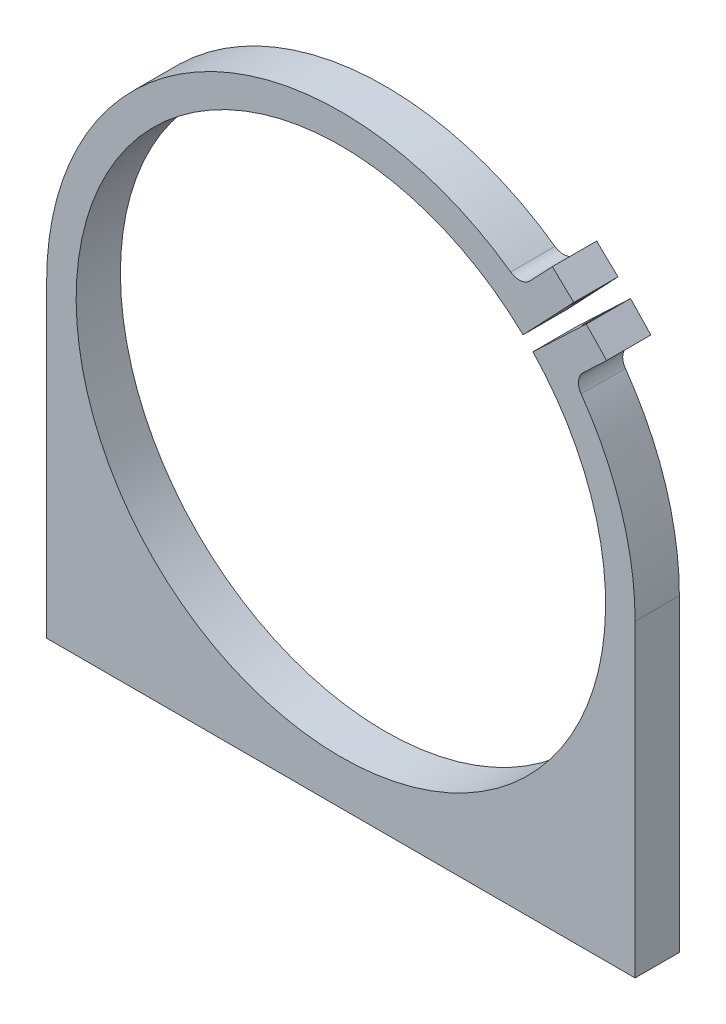
ISO-10303-21;
HEADER;
FILE_DESCRIPTION(('STEP AP214'),'2;1');
FILE_NAME('part.step','',(''),(''),'','','');
FILE_SCHEMA(('AUTOMOTIVE_DESIGN { 1 0 10303 214 1 1 1 1 }'));
ENDSEC;
DATA;
#1=APPLICATION_CONTEXT('core data for automotive mechanical design processes');
#2=APPLICATION_PROTOCOL_DEFINITION('international standard','automotive_design',2000,#1);
#3=PRODUCT_CONTEXT('',#1,'mechanical');
#4=PRODUCT('Part','Part','',(#3));
#5=PRODUCT_RELATED_PRODUCT_CATEGORY('part','',(#4));
#6=PRODUCT_DEFINITION_FORMATION('','',#4);
#7=PRODUCT_DEFINITION_CONTEXT('part definition',#1,'design');
#8=PRODUCT_DEFINITION('design','',#6,#7);
#9=PRODUCT_DEFINITION_SHAPE('','',#8);
#10=(LENGTH_UNIT() NAMED_UNIT(*) SI_UNIT(.MILLI.,.METRE.));
#11=(NAMED_UNIT(*) PLANE_ANGLE_UNIT() SI_UNIT($,.RADIAN.));
#12=(NAMED_UNIT(*) SI_UNIT($,.STERADIAN.) SOLID_ANGLE_UNIT());
#13=UNCERTAINTY_MEASURE_WITH_UNIT(LENGTH_MEASURE(1.E-05),#10,'distance_accuracy_value','');
#14=(GEOMETRIC_REPRESENTATION_CONTEXT(3) GLOBAL_UNCERTAINTY_ASSIGNED_CONTEXT((#13)) GLOBAL_UNIT_ASSIGNED_CONTEXT((#10,
#11,#12)) REPRESENTATION_CONTEXT('',''));
#15=CARTESIAN_POINT('',(0.,0.,0.));
#16=DIRECTION('',(0.,0.,1.));
#17=DIRECTION('',(1.,0.,0.));
#18=AXIS2_PLACEMENT_3D('',#15,#16,#17);
#19=CARTESIAN_POINT('',(0.,0.,9.525));
#20=DIRECTION('',(0.,0.,-1.));
#21=DIRECTION('',(-1.,0.,0.));
#22=AXIS2_PLACEMENT_3D('',#19,#20,#21);
#23=CYLINDRICAL_SURFACE('',#22,63.3222);
#24=CARTESIAN_POINT('',(0.,0.,0.));
#25=DIRECTION('',(0.,0.,1.));
#26=DIRECTION('',(1.,0.,0.));
#27=AXIS2_PLACEMENT_3D('',#24,#25,#26);
#28=CIRCLE('',#27,63.3222);
#29=CARTESIAN_POINT('',(36.5422559740433,51.7142585866557,0.));
#30=VERTEX_POINT('',#29);
#31=CARTESIAN_POINT('',(-63.3222,0.,0.));
#32=VERTEX_POINT('',#31);
#33=EDGE_CURVE('E171',#30,#32,#28,.T.);
#34=ORIENTED_EDGE('',*,*,#33,.T.);
#35=DIRECTION('',(0.,0.,-1.));
#36=VECTOR('',#35,1.);
#37=CARTESIAN_POINT('',(-63.3222,0.,9.525));
#38=LINE('',#37,#36);
#39=CARTESIAN_POINT('',(-63.3222,0.,9.525));
#40=VERTEX_POINT('',#39);
#41=EDGE_CURVE('E11',#40,#32,#38,.T.);
#42=ORIENTED_EDGE('',*,*,#41,.F.);
#43=CARTESIAN_POINT('',(0.,0.,9.525));
#44=DIRECTION('',(0.,0.,1.));
#45=DIRECTION('',(1.,0.,0.));
#46=AXIS2_PLACEMENT_3D('',#43,#44,#45);
#47=CIRCLE('',#46,63.3222);
#48=CARTESIAN_POINT('',(36.5422559740433,51.7142585866557,9.525));
#49=VERTEX_POINT('',#48);
#50=EDGE_CURVE('E204',#49,#40,#47,.T.);
#51=ORIENTED_EDGE('',*,*,#50,.F.);
#52=DIRECTION('',(0.,0.,-1.));
#53=VECTOR('',#52,1.);
#54=CARTESIAN_POINT('',(36.5422559740433,51.7142585866557,9.525));
#55=LINE('',#54,#53);
#56=EDGE_CURVE('E167',#49,#30,#55,.T.);
#57=ORIENTED_EDGE('',*,*,#56,.T.);
#58=EDGE_LOOP('',(#34,#42,#51,#57));
#59=FACE_BOUND('',#58,.T.);
#60=ADVANCED_FACE('F37',(#59),#23,.T.);
#61=CARTESIAN_POINT('',(-63.3222,0.,9.525));
#62=DIRECTION('',(1.,0.,0.));
#63=DIRECTION('',(0.,1.,0.));
#64=AXIS2_PLACEMENT_3D('',#61,#62,#63);
#65=PLANE('',#64);
#66=DIRECTION('',(0.,-1.,0.));
#67=VECTOR('',#66,1.);
#68=CARTESIAN_POINT('',(-63.3222,0.,0.));
#69=LINE('',#68,#67);
#70=CARTESIAN_POINT('',(-63.3222,-66.4972,0.));
#71=VERTEX_POINT('',#70);
#72=EDGE_CURVE('E174',#32,#71,#69,.T.);
#73=ORIENTED_EDGE('',*,*,#72,.T.);
#74=DIRECTION('',(0.,0.,-1.));
#75=VECTOR('',#74,1.);
#76=CARTESIAN_POINT('',(-63.3222,-66.4972,9.525));
#77=LINE('',#76,#75);
#78=CARTESIAN_POINT('',(-63.3222,-66.4972,9.525));
#79=VERTEX_POINT('',#78);
#80=EDGE_CURVE('E46',#79,#71,#77,.T.);
#81=ORIENTED_EDGE('',*,*,#80,.F.);
#82=DIRECTION('',(0.,-1.,0.));
#83=VECTOR('',#82,1.);
#84=CARTESIAN_POINT('',(-63.3222,0.,9.525));
#85=LINE('',#84,#83);
#86=EDGE_CURVE('E115',#40,#79,#85,.T.);
#87=ORIENTED_EDGE('',*,*,#86,.F.);
#88=ORIENTED_EDGE('',*,*,#41,.T.);
#89=EDGE_LOOP('',(#73,#81,#87,#88));
#90=FACE_BOUND('',#89,.T.);
#91=ADVANCED_FACE('F291',(#90),#65,.F.);
#92=CARTESIAN_POINT('',(-63.3222,-66.4972,9.525));
#93=DIRECTION('',(0.,1.,0.));
#94=DIRECTION('',(-1.,0.,0.));
#95=AXIS2_PLACEMENT_3D('',#92,#93,#94);
#96=PLANE('',#95);
#97=CARTESIAN_POINT('',(41.275,-66.4972,4.76250000000001));
#98=DIRECTION('',(0.,-1.,0.));
#99=DIRECTION('',(0.,0.,-1.));
#100=AXIS2_PLACEMENT_3D('',#97,#98,#99);
#101=CIRCLE('',#100,2.01929999999999);
#102=CARTESIAN_POINT('',(41.275,-66.4972,2.74320000000003));
#103=VERTEX_POINT('',#102);
#104=EDGE_CURVE('E349',#103,#103,#101,.T.);
#105=ORIENTED_EDGE('',*,*,#104,.F.);
#106=EDGE_LOOP('',(#105));
#107=FACE_BOUND('',#106,.T.);
#108=CARTESIAN_POINT('',(-41.275,-66.4972,4.7625));
#109=DIRECTION('',(0.,-1.,0.));
#110=DIRECTION('',(0.,0.,-1.));
#111=AXIS2_PLACEMENT_3D('',#108,#109,#110);
#112=CIRCLE('',#111,2.01929999999999);
#113=CARTESIAN_POINT('',(-41.275,-66.4972,2.74320000000001));
#114=VERTEX_POINT('',#113);
#115=EDGE_CURVE('E355',#114,#114,#112,.T.);
#116=ORIENTED_EDGE('',*,*,#115,.F.);
#117=EDGE_LOOP('',(#116));
#118=FACE_BOUND('',#117,.T.);
#119=DIRECTION('',(1.,0.,0.));
#120=VECTOR('',#119,1.);
#121=CARTESIAN_POINT('',(-63.3222,-66.4972,0.));
#122=LINE('',#121,#120);
#123=CARTESIAN_POINT('',(63.3222,-66.4972,0.));
#124=VERTEX_POINT('',#123);
#125=EDGE_CURVE('E177',#71,#124,#122,.T.);
#126=ORIENTED_EDGE('',*,*,#125,.T.);
#127=DIRECTION('',(0.,0.,-1.));
#128=VECTOR('',#127,1.);
#129=CARTESIAN_POINT('',(63.3222,-66.4972,9.525));
#130=LINE('',#129,#128);
#131=CARTESIAN_POINT('',(63.3222,-66.4972,9.525));
#132=VERTEX_POINT('',#131);
#133=EDGE_CURVE('E223',#132,#124,#130,.T.);
#134=ORIENTED_EDGE('',*,*,#133,.F.);
#135=DIRECTION('',(1.,0.,0.));
#136=VECTOR('',#135,1.);
#137=CARTESIAN_POINT('',(-63.3222,-66.4972,9.525));
#138=LINE('',#137,#136);
#139=EDGE_CURVE('E232',#79,#132,#138,.T.);
#140=ORIENTED_EDGE('',*,*,#139,.F.);
#141=ORIENTED_EDGE('',*,*,#80,.T.);
#142=EDGE_LOOP('',(#126,#134,#140,#141));
#143=FACE_BOUND('',#142,.T.);
#144=ADVANCED_FACE('F230',(#107,#118,#143),#96,.F.);
#145=CARTESIAN_POINT('',(63.3222,-66.4972,9.525));
#146=DIRECTION('',(-1.,0.,0.));
#147=DIRECTION('',(0.,-1.,0.));
#148=AXIS2_PLACEMENT_3D('',#145,#146,#147);
#149=PLANE('',#148);
#150=DIRECTION('',(0.,1.,0.));
#151=VECTOR('',#150,1.);
#152=CARTESIAN_POINT('',(63.3222,-66.4972,0.));
#153=LINE('',#152,#151);
#154=CARTESIAN_POINT('',(63.3222,0.,0.));
#155=VERTEX_POINT('',#154);
#156=EDGE_CURVE('E179',#124,#155,#153,.T.);
#157=ORIENTED_EDGE('',*,*,#156,.T.);
#158=DIRECTION('',(0.,0.,-1.));
#159=VECTOR('',#158,1.);
#160=CARTESIAN_POINT('',(63.3222,0.,9.525));
#161=LINE('',#160,#159);
#162=CARTESIAN_POINT('',(63.3222,0.,9.525));
#163=VERTEX_POINT('',#162);
#164=EDGE_CURVE('E220',#163,#155,#161,.T.);
#165=ORIENTED_EDGE('',*,*,#164,.F.);
#166=DIRECTION('',(0.,1.,0.));
#167=VECTOR('',#166,1.);
#168=CARTESIAN_POINT('',(63.3222,-66.4972,9.525));
#169=LINE('',#168,#167);
#170=EDGE_CURVE('E250',#132,#163,#169,.T.);
#171=ORIENTED_EDGE('',*,*,#170,.F.);
#172=ORIENTED_EDGE('',*,*,#133,.T.);
#173=EDGE_LOOP('',(#157,#165,#171,#172));
#174=FACE_BOUND('',#173,.T.);
#175=ADVANCED_FACE('F240',(#174),#149,.F.);
#176=CARTESIAN_POINT('',(0.,0.,9.525));
#177=DIRECTION('',(0.,0.,-1.));
#178=DIRECTION('',(-1.,0.,0.));
#179=AXIS2_PLACEMENT_3D('',#176,#177,#178);
#180=CYLINDRICAL_SURFACE('',#179,63.3222);
#181=CARTESIAN_POINT('',(0.,0.,0.));
#182=DIRECTION('',(0.,0.,1.));
#183=DIRECTION('',(1.,0.,0.));
#184=AXIS2_PLACEMENT_3D('',#181,#182,#183);
#185=CIRCLE('',#184,63.3222);
#186=CARTESIAN_POINT('',(51.7142585866553,36.5422559740439,0.));
#187=VERTEX_POINT('',#186);
#188=EDGE_CURVE('E181',#155,#187,#185,.T.);
#189=ORIENTED_EDGE('',*,*,#188,.T.);
#190=DIRECTION('',(0.,0.,-1.));
#191=VECTOR('',#190,1.);
#192=CARTESIAN_POINT('',(51.7142585866553,36.5422559740439,9.525));
#193=LINE('',#192,#191);
#194=CARTESIAN_POINT('',(51.7142585866553,36.5422559740439,9.525));
#195=VERTEX_POINT('',#194);
#196=EDGE_CURVE('E218',#195,#187,#193,.T.);
#197=ORIENTED_EDGE('',*,*,#196,.F.);
#198=CARTESIAN_POINT('',(0.,0.,9.525));
#199=DIRECTION('',(0.,0.,1.));
#200=DIRECTION('',(1.,0.,0.));
#201=AXIS2_PLACEMENT_3D('',#198,#199,#200);
#202=CIRCLE('',#201,63.3222);
#203=EDGE_CURVE('E246',#163,#195,#202,.T.);
#204=ORIENTED_EDGE('',*,*,#203,.F.);
#205=ORIENTED_EDGE('',*,*,#164,.T.);
#206=EDGE_LOOP('',(#189,#197,#204,#205));
#207=FACE_BOUND('',#206,.T.);
#208=ADVANCED_FACE('F244',(#207),#180,.T.);
#209=CARTESIAN_POINT('',(54.3279756271361,38.3891569980028,9.525));
#210=DIRECTION('',(0.,0.,-1.));
#211=DIRECTION('',(-1.,0.,0.));
#212=AXIS2_PLACEMENT_3D('',#209,#210,#211);
#213=CYLINDRICAL_SURFACE('',#212,3.20040000000001);
#214=CARTESIAN_POINT('',(54.3279756271361,38.3891569980028,0.));
#215=DIRECTION('',(0.,0.,1.));
#216=DIRECTION('',(1.,0.,0.));
#217=AXIS2_PLACEMENT_3D('',#214,#215,#216);
#218=CIRCLE('',#217,3.20040000000001);
#219=CARTESIAN_POINT('',(52.1249656430858,40.7106451349905,0.));
#220=VERTEX_POINT('',#219);
#221=EDGE_CURVE('E184',#220,#187,#218,.T.);
#222=ORIENTED_EDGE('',*,*,#221,.F.);
#223=DIRECTION('',(0.,0.,-1.));
#224=VECTOR('',#223,1.);
#225=CARTESIAN_POINT('',(52.1249656430858,40.7106451349905,9.525));
#226=LINE('',#225,#224);
#227=CARTESIAN_POINT('',(52.1249656430858,40.7106451349905,9.525));
#228=VERTEX_POINT('',#227);
#229=EDGE_CURVE('E216',#228,#220,#226,.T.);
#230=ORIENTED_EDGE('',*,*,#229,.F.);
#231=CARTESIAN_POINT('',(54.3279756271361,38.3891569980028,9.525));
#232=DIRECTION('',(0.,0.,1.));
#233=DIRECTION('',(1.,0.,0.));
#234=AXIS2_PLACEMENT_3D('',#231,#232,#233);
#235=CIRCLE('',#234,3.20040000000001);
#236=EDGE_CURVE('E249',#228,#195,#235,.T.);
#237=ORIENTED_EDGE('',*,*,#236,.T.);
#238=ORIENTED_EDGE('',*,*,#196,.T.);
#239=EDGE_LOOP('',(#222,#230,#237,#238));
#240=FACE_BOUND('',#239,.T.);
#241=ADVANCED_FACE('F376',(#240),#213,.F.);
#242=CARTESIAN_POINT('',(57.1917056246066,45.5188018462114,9.525));
#243=DIRECTION('',(0.688354575693758,-0.725374371012284,0.));
#244=DIRECTION('',(0.725374371012284,0.688354575693758,0.));
#245=AXIS2_PLACEMENT_3D('',#242,#243,#244);
#246=PLANE('',#245);
#247=CARTESIAN_POINT('',(54.6583356338462,43.114723490601,4.7625));
#248=DIRECTION('',(0.688354575693758,-0.725374371012284,0.));
#249=DIRECTION('',(0.725374371012284,0.688354575693758,0.));
#250=AXIS2_PLACEMENT_3D('',#247,#248,#249);
#251=CIRCLE('',#250,2.59079999999999);
#252=CARTESIAN_POINT('',(56.5376355542648,44.8981125253084,4.7625));
#253=VERTEX_POINT('',#252);
#254=EDGE_CURVE('E341',#253,#253,#251,.T.);
#255=ORIENTED_EDGE('',*,*,#254,.F.);
#256=EDGE_LOOP('',(#255));
#257=FACE_BOUND('',#256,.T.);
#258=DIRECTION('',(-0.725374371012284,-0.688354575693758,0.));
#259=VECTOR('',#258,1.);
#260=CARTESIAN_POINT('',(57.1917056246066,45.5188018462114,0.));
#261=LINE('',#260,#259);
#262=CARTESIAN_POINT('',(57.1917056246066,45.5188018462114,0.));
#263=VERTEX_POINT('',#262);
#264=EDGE_CURVE('E187',#263,#220,#261,.T.);
#265=ORIENTED_EDGE('',*,*,#264,.F.);
#266=DIRECTION('',(0.,0.,-1.));
#267=VECTOR('',#266,1.);
#268=CARTESIAN_POINT('',(57.1917056246066,45.5188018462114,9.525));
#269=LINE('',#268,#267);
#270=CARTESIAN_POINT('',(57.1917056246066,45.5188018462114,9.525));
#271=VERTEX_POINT('',#270);
#272=EDGE_CURVE('E214',#271,#263,#269,.T.);
#273=ORIENTED_EDGE('',*,*,#272,.F.);
#274=DIRECTION('',(-0.725374371012284,-0.688354575693758,0.));
#275=VECTOR('',#274,1.);
#276=CARTESIAN_POINT('',(57.1917056246066,45.5188018462114,9.525));
#277=LINE('',#276,#275);
#278=EDGE_CURVE('E252',#271,#228,#277,.T.);
#279=ORIENTED_EDGE('',*,*,#278,.T.);
#280=ORIENTED_EDGE('',*,*,#229,.T.);
#281=EDGE_LOOP('',(#265,#273,#279,#280));
#282=FACE_BOUND('',#281,.T.);
#283=ADVANCED_FACE('F379',(#257,#282),#246,.T.);
#284=CARTESIAN_POINT('',(52.8206540689512,50.1249291021394,9.525));
#285=DIRECTION('',(0.725374371012285,0.688354575693757,0.));
#286=DIRECTION('',(-0.688354575693757,0.725374371012285,0.));
#287=AXIS2_PLACEMENT_3D('',#284,#285,#286);
#288=PLANE('',#287);
#289=DIRECTION('',(0.688354575693757,-0.725374371012285,0.));
#290=VECTOR('',#289,1.);
#291=CARTESIAN_POINT('',(52.8206540689512,50.1249291021394,0.));
#292=LINE('',#291,#290);
#293=CARTESIAN_POINT('',(52.8206540689512,50.1249291021394,0.));
#294=VERTEX_POINT('',#293);
#295=EDGE_CURVE('E190',#294,#263,#292,.T.);
#296=ORIENTED_EDGE('',*,*,#295,.F.);
#297=DIRECTION('',(0.,0.,-1.));
#298=VECTOR('',#297,1.);
#299=CARTESIAN_POINT('',(52.8206540689512,50.1249291021394,9.525));
#300=LINE('',#299,#298);
#301=CARTESIAN_POINT('',(52.8206540689512,50.1249291021394,9.525));
#302=VERTEX_POINT('',#301);
#303=EDGE_CURVE('E212',#302,#294,#300,.T.);
#304=ORIENTED_EDGE('',*,*,#303,.F.);
#305=DIRECTION('',(0.688354575693757,-0.725374371012285,0.));
#306=VECTOR('',#305,1.);
#307=CARTESIAN_POINT('',(52.8206540689512,50.1249291021394,9.525));
#308=LINE('',#307,#306);
#309=EDGE_CURVE('E259',#302,#271,#308,.T.);
#310=ORIENTED_EDGE('',*,*,#309,.T.);
#311=ORIENTED_EDGE('',*,*,#272,.T.);
#312=EDGE_LOOP('',(#296,#304,#310,#311));
#313=FACE_BOUND('',#312,.T.);
#314=ADVANCED_FACE('F383',(#313),#288,.T.);
#315=CARTESIAN_POINT('',(41.326173740186,39.2170745573399,9.525));
#316=DIRECTION('',(-0.688354575693758,0.725374371012284,0.));
#317=DIRECTION('',(-0.725374371012284,-0.688354575693758,0.));
#318=AXIS2_PLACEMENT_3D('',#315,#316,#317);
#319=PLANE('',#318);
#320=CARTESIAN_POINT('',(50.2872840781908,47.720850746529,4.7625));
#321=DIRECTION('',(-0.688354575693758,0.725374371012284,0.));
#322=DIRECTION('',(-0.725374371012284,-0.688354575693758,0.));
#323=AXIS2_PLACEMENT_3D('',#320,#321,#322);
#324=CIRCLE('',#323,2.59079999999998);
#325=CARTESIAN_POINT('',(48.4079841577722,45.9374617118216,4.7625));
#326=VERTEX_POINT('',#325);
#327=EDGE_CURVE('E338',#326,#326,#324,.T.);
#328=ORIENTED_EDGE('',*,*,#327,.F.);
#329=EDGE_LOOP('',(#328));
#330=FACE_BOUND('',#329,.T.);
#331=DIRECTION('',(0.725374371012284,0.688354575693758,0.));
#332=VECTOR('',#331,1.);
#333=CARTESIAN_POINT('',(41.326173740186,39.2170745573399,0.));
#334=LINE('',#333,#332);
#335=CARTESIAN_POINT('',(41.326173740186,39.2170745573399,0.));
#336=VERTEX_POINT('',#335);
#337=EDGE_CURVE('E193',#336,#294,#334,.T.);
#338=ORIENTED_EDGE('',*,*,#337,.F.);
#339=DIRECTION('',(0.,0.,-1.));
#340=VECTOR('',#339,1.);
#341=CARTESIAN_POINT('',(41.326173740186,39.2170745573399,9.525));
#342=LINE('',#341,#340);
#343=CARTESIAN_POINT('',(41.326173740186,39.2170745573399,9.525));
#344=VERTEX_POINT('',#343);
#345=EDGE_CURVE('E210',#344,#336,#342,.T.);
#346=ORIENTED_EDGE('',*,*,#345,.F.);
#347=DIRECTION('',(0.725374371012284,0.688354575693758,0.));
#348=VECTOR('',#347,1.);
#349=CARTESIAN_POINT('',(41.326173740186,39.2170745573399,9.525));
#350=LINE('',#349,#348);
#351=EDGE_CURVE('E262',#344,#302,#350,.T.);
#352=ORIENTED_EDGE('',*,*,#351,.T.);
#353=ORIENTED_EDGE('',*,*,#303,.T.);
#354=EDGE_LOOP('',(#338,#346,#352,#353));
#355=FACE_BOUND('',#354,.T.);
#356=ADVANCED_FACE('F275',(#330,#355),#319,.T.);
#357=CARTESIAN_POINT('',(0.,0.,9.525));
#358=DIRECTION('',(0.,0.,-1.));
#359=DIRECTION('',(-1.,0.,0.));
#360=AXIS2_PLACEMENT_3D('',#357,#358,#359);
#361=CYLINDRICAL_SURFACE('',#360,56.9722);
#362=CARTESIAN_POINT('',(0.,0.,0.));
#363=DIRECTION('',(0.,0.,1.));
#364=DIRECTION('',(1.,0.,0.));
#365=AXIS2_PLACEMENT_3D('',#362,#363,#364);
#366=CIRCLE('',#365,56.9722);
#367=CARTESIAN_POINT('',(39.2170745573395,41.3261737401865,0.));
#368=VERTEX_POINT('',#367);
#369=EDGE_CURVE('E196',#368,#336,#366,.T.);
#370=ORIENTED_EDGE('',*,*,#369,.F.);
#371=DIRECTION('',(0.,0.,-1.));
#372=VECTOR('',#371,1.);
#373=CARTESIAN_POINT('',(39.2170745573395,41.3261737401865,9.525));
#374=LINE('',#373,#372);
#375=CARTESIAN_POINT('',(39.2170745573395,41.3261737401865,9.525));
#376=VERTEX_POINT('',#375);
#377=EDGE_CURVE('E208',#376,#368,#374,.T.);
#378=ORIENTED_EDGE('',*,*,#377,.F.);
#379=CARTESIAN_POINT('',(0.,0.,9.525));
#380=DIRECTION('',(0.,0.,1.));
#381=DIRECTION('',(1.,0.,0.));
#382=AXIS2_PLACEMENT_3D('',#379,#380,#381);
#383=CIRCLE('',#382,56.9722);
#384=EDGE_CURVE('E265',#376,#344,#383,.T.);
#385=ORIENTED_EDGE('',*,*,#384,.T.);
#386=ORIENTED_EDGE('',*,*,#345,.T.);
#387=EDGE_LOOP('',(#370,#378,#385,#386));
#388=FACE_BOUND('',#387,.T.);
#389=ADVANCED_FACE('F269',(#388),#361,.F.);
#390=CARTESIAN_POINT('',(39.2170745573395,41.3261737401865,9.525));
#391=DIRECTION('',(-0.725374371012292,0.68835457569375,0.));
#392=DIRECTION('',(-0.68835457569375,-0.725374371012292,0.));
#393=AXIS2_PLACEMENT_3D('',#390,#391,#392);
#394=PLANE('',#393);
#395=CARTESIAN_POINT('',(47.7863402650678,50.3562956312424,4.7625));
#396=DIRECTION('',(-0.725374371012292,0.68835457569375,0.));
#397=DIRECTION('',(-0.68835457569375,-0.725374371012292,0.));
#398=AXIS2_PLACEMENT_3D('',#395,#396,#397);
#399=ELLIPSE('',#398,2.5943554740114,2.59079999999998);
#400=CARTESIAN_POINT('',(46.0005038035559,48.4744166610991,4.7625));
#401=VERTEX_POINT('',#400);
#402=EDGE_CURVE('E40',#401,#401,#399,.T.);
#403=ORIENTED_EDGE('',*,*,#402,.T.);
#404=EDGE_LOOP('',(#403));
#405=FACE_BOUND('',#404,.T.);
#406=DIRECTION('',(0.68835457569375,0.725374371012292,0.));
#407=VECTOR('',#406,1.);
#408=CARTESIAN_POINT('',(39.2170745573395,41.3261737401865,0.));
#409=LINE('',#408,#407);
#410=CARTESIAN_POINT('',(50.1249291021388,52.8206540689518,0.));
#411=VERTEX_POINT('',#410);
#412=EDGE_CURVE('E199',#368,#411,#409,.T.);
#413=ORIENTED_EDGE('',*,*,#412,.T.);
#414=DIRECTION('',(0.,0.,-1.));
#415=VECTOR('',#414,1.);
#416=CARTESIAN_POINT('',(50.1249291021388,52.8206540689518,9.525));
#417=LINE('',#416,#415);
#418=CARTESIAN_POINT('',(50.1249291021388,52.8206540689518,9.525));
#419=VERTEX_POINT('',#418);
#420=EDGE_CURVE('E162',#419,#411,#417,.T.);
#421=ORIENTED_EDGE('',*,*,#420,.F.);
#422=DIRECTION('',(0.68835457569375,0.725374371012292,0.));
#423=VECTOR('',#422,1.);
#424=CARTESIAN_POINT('',(39.2170745573395,41.3261737401865,9.525));
#425=LINE('',#424,#423);
#426=EDGE_CURVE('E153',#376,#419,#425,.T.);
#427=ORIENTED_EDGE('',*,*,#426,.F.);
#428=ORIENTED_EDGE('',*,*,#377,.T.);
#429=EDGE_LOOP('',(#413,#421,#427,#428));
#430=FACE_BOUND('',#429,.T.);
#431=ADVANCED_FACE('F279',(#405,#430),#394,.F.);
#432=CARTESIAN_POINT('',(50.1249291021388,52.8206540689518,9.525));
#433=DIRECTION('',(-0.688354575693749,-0.725374371012292,0.));
#434=DIRECTION('',(0.725374371012292,-0.688354575693749,0.));
#435=AXIS2_PLACEMENT_3D('',#432,#433,#434);
#436=PLANE('',#435);
#437=DIRECTION('',(-0.725374371012292,0.688354575693749,0.));
#438=VECTOR('',#437,1.);
#439=CARTESIAN_POINT('',(50.1249291021388,52.8206540689518,0.));
#440=LINE('',#439,#438);
#441=CARTESIAN_POINT('',(45.5188018462108,57.1917056246071,0.));
#442=VERTEX_POINT('',#441);
#443=EDGE_CURVE('E161',#411,#442,#440,.T.);
#444=ORIENTED_EDGE('',*,*,#443,.T.);
#445=DIRECTION('',(0.,0.,-1.));
#446=VECTOR('',#445,1.);
#447=CARTESIAN_POINT('',(45.5188018462108,57.1917056246071,9.525));
#448=LINE('',#447,#446);
#449=CARTESIAN_POINT('',(45.5188018462108,57.1917056246071,9.525));
#450=VERTEX_POINT('',#449);
#451=EDGE_CURVE('E158',#450,#442,#448,.T.);
#452=ORIENTED_EDGE('',*,*,#451,.F.);
#453=DIRECTION('',(-0.725374371012292,0.688354575693749,0.));
#454=VECTOR('',#453,1.);
#455=CARTESIAN_POINT('',(50.1249291021388,52.8206540689518,9.525));
#456=LINE('',#455,#454);
#457=EDGE_CURVE('E146',#419,#450,#456,.T.);
#458=ORIENTED_EDGE('',*,*,#457,.F.);
#459=ORIENTED_EDGE('',*,*,#420,.T.);
#460=EDGE_LOOP('',(#444,#452,#458,#459));
#461=FACE_BOUND('',#460,.T.);
#462=ADVANCED_FACE('F159',(#461),#436,.F.);
#463=CARTESIAN_POINT('',(45.5188018462108,57.1917056246071,9.525));
#464=DIRECTION('',(0.725374371012292,-0.688354575693749,0.));
#465=DIRECTION('',(0.688354575693749,0.725374371012292,0.));
#466=AXIS2_PLACEMENT_3D('',#463,#464,#465);
#467=PLANE('',#466);
#468=CARTESIAN_POINT('',(43.4092901143033,54.968744087476,4.7625));
#469=DIRECTION('',(0.725374371012292,-0.688354575693749,0.));
#470=DIRECTION('',(-0.688354575693749,-0.725374371012292,0.));
#471=AXIS2_PLACEMENT_3D('',#468,#469,#470);
#472=ELLIPSE('',#471,2.5943554740114,2.59079999999998);
#473=CARTESIAN_POINT('',(41.6234536527915,53.0868651173327,4.7625));
#474=VERTEX_POINT('',#473);
#475=EDGE_CURVE('E346',#474,#474,#472,.T.);
#476=ORIENTED_EDGE('',*,*,#475,.T.);
#477=EDGE_LOOP('',(#476));
#478=FACE_BOUND('',#477,.T.);
#479=DIRECTION('',(-0.688354575693749,-0.725374371012292,0.));
#480=VECTOR('',#479,1.);
#481=CARTESIAN_POINT('',(45.5188018462108,57.1917056246071,0.));
#482=LINE('',#481,#480);
#483=CARTESIAN_POINT('',(40.7106451349899,52.1249656430862,0.));
#484=VERTEX_POINT('',#483);
#485=EDGE_CURVE('E101',#442,#484,#482,.T.);
#486=ORIENTED_EDGE('',*,*,#485,.T.);
#487=DIRECTION('',(0.,0.,-1.));
#488=VECTOR('',#487,1.);
#489=CARTESIAN_POINT('',(40.7106451349899,52.1249656430862,9.525));
#490=LINE('',#489,#488);
#491=CARTESIAN_POINT('',(40.7106451349899,52.1249656430862,9.525));
#492=VERTEX_POINT('',#491);
#493=EDGE_CURVE('E163',#492,#484,#490,.T.);
#494=ORIENTED_EDGE('',*,*,#493,.F.);
#495=DIRECTION('',(-0.688354575693749,-0.725374371012292,0.));
#496=VECTOR('',#495,1.);
#497=CARTESIAN_POINT('',(45.5188018462108,57.1917056246071,9.525));
#498=LINE('',#497,#496);
#499=EDGE_CURVE('E150',#450,#492,#498,.T.);
#500=ORIENTED_EDGE('',*,*,#499,.F.);
#501=ORIENTED_EDGE('',*,*,#451,.T.);
#502=EDGE_LOOP('',(#486,#494,#500,#501));
#503=FACE_BOUND('',#502,.T.);
#504=ADVANCED_FACE('F165',(#478,#503),#467,.F.);
#505=CARTESIAN_POINT('',(38.3891569980022,54.3279756271365,9.525));
#506=DIRECTION('',(0.,0.,-1.));
#507=DIRECTION('',(-1.,0.,0.));
#508=AXIS2_PLACEMENT_3D('',#505,#506,#507);
#509=CYLINDRICAL_SURFACE('',#508,3.20040000000002);
#510=CARTESIAN_POINT('',(38.3891569980022,54.3279756271365,0.));
#511=DIRECTION('',(0.,0.,-1.));
#512=DIRECTION('',(-1.,0.,0.));
#513=AXIS2_PLACEMENT_3D('',#510,#511,#512);
#514=CIRCLE('',#513,3.20040000000002);
#515=EDGE_CURVE('E107',#484,#30,#514,.T.);
#516=ORIENTED_EDGE('',*,*,#515,.T.);
#517=ORIENTED_EDGE('',*,*,#56,.F.);
#518=CARTESIAN_POINT('',(38.3891569980022,54.3279756271365,9.525));
#519=DIRECTION('',(0.,0.,-1.));
#520=DIRECTION('',(-1.,0.,0.));
#521=AXIS2_PLACEMENT_3D('',#518,#519,#520);
#522=CIRCLE('',#521,3.20040000000002);
#523=EDGE_CURVE('E54',#492,#49,#522,.T.);
#524=ORIENTED_EDGE('',*,*,#523,.F.);
#525=ORIENTED_EDGE('',*,*,#493,.T.);
#526=EDGE_LOOP('',(#516,#517,#524,#525));
#527=FACE_BOUND('',#526,.T.);
#528=ADVANCED_FACE('F298',(#527),#509,.F.);
#529=CARTESIAN_POINT('',(0.,0.,9.525));
#530=DIRECTION('',(0.,0.,1.));
#531=DIRECTION('',(1.,0.,0.));
#532=AXIS2_PLACEMENT_3D('',#529,#530,#531);
#533=PLANE('',#532);
#534=ORIENTED_EDGE('',*,*,#50,.T.);
#535=ORIENTED_EDGE('',*,*,#86,.T.);
#536=ORIENTED_EDGE('',*,*,#139,.T.);
#537=ORIENTED_EDGE('',*,*,#170,.T.);
#538=ORIENTED_EDGE('',*,*,#203,.T.);
#539=ORIENTED_EDGE('',*,*,#236,.F.);
#540=ORIENTED_EDGE('',*,*,#278,.F.);
#541=ORIENTED_EDGE('',*,*,#309,.F.);
#542=ORIENTED_EDGE('',*,*,#351,.F.);
#543=ORIENTED_EDGE('',*,*,#384,.F.);
#544=ORIENTED_EDGE('',*,*,#426,.T.);
#545=ORIENTED_EDGE('',*,*,#457,.T.);
#546=ORIENTED_EDGE('',*,*,#499,.T.);
#547=ORIENTED_EDGE('',*,*,#523,.T.);
#548=EDGE_LOOP('',(#534,#535,#536,#537,#538,#539,#540,#541,#542,#543,#544,#545,#546,#547));
#549=FACE_BOUND('',#548,.T.);
#550=ADVANCED_FACE('F148',(#549),#533,.T.);
#551=CARTESIAN_POINT('',(0.,0.,0.));
#552=DIRECTION('',(0.,0.,1.));
#553=DIRECTION('',(1.,0.,0.));
#554=AXIS2_PLACEMENT_3D('',#551,#552,#553);
#555=PLANE('',#554);
#556=ORIENTED_EDGE('',*,*,#33,.F.);
#557=ORIENTED_EDGE('',*,*,#515,.F.);
#558=ORIENTED_EDGE('',*,*,#485,.F.);
#559=ORIENTED_EDGE('',*,*,#443,.F.);
#560=ORIENTED_EDGE('',*,*,#412,.F.);
#561=ORIENTED_EDGE('',*,*,#369,.T.);
#562=ORIENTED_EDGE('',*,*,#337,.T.);
#563=ORIENTED_EDGE('',*,*,#295,.T.);
#564=ORIENTED_EDGE('',*,*,#264,.T.);
#565=ORIENTED_EDGE('',*,*,#221,.T.);
#566=ORIENTED_EDGE('',*,*,#188,.F.);
#567=ORIENTED_EDGE('',*,*,#156,.F.);
#568=ORIENTED_EDGE('',*,*,#125,.F.);
#569=ORIENTED_EDGE('',*,*,#72,.F.);
#570=EDGE_LOOP('',(#556,#557,#558,#559,#560,#561,#562,#563,#564,#565,#566,#567,#568,#569));
#571=FACE_BOUND('',#570,.T.);
#572=ADVANCED_FACE('F236',(#571),#555,.F.);
#573=CARTESIAN_POINT('',(-41.275,-51.9176,4.7625));
#574=DIRECTION('',(0.,1.,0.));
#575=DIRECTION('',(0.,0.,1.));
#576=AXIS2_PLACEMENT_3D('',#573,#574,#575);
#577=PLANE('',#576);
#578=CARTESIAN_POINT('',(-41.275,-51.9176,4.7625));
#579=DIRECTION('',(0.,-1.,0.));
#580=DIRECTION('',(0.,0.,-1.));
#581=AXIS2_PLACEMENT_3D('',#578,#579,#580);
#582=CIRCLE('',#581,2.01929999999999);
#583=CARTESIAN_POINT('',(-41.275,-51.9176,2.74320000000001));
#584=VERTEX_POINT('',#583);
#585=EDGE_CURVE('E175',#584,#584,#582,.T.);
#586=ORIENTED_EDGE('',*,*,#585,.T.);
#587=EDGE_LOOP('',(#586));
#588=FACE_BOUND('',#587,.T.);
#589=ADVANCED_FACE('F310',(#588),#577,.F.);
#590=CARTESIAN_POINT('',(-41.275,-66.4972,4.7625));
#591=DIRECTION('',(0.,-1.,0.));
#592=DIRECTION('',(0.,0.,-1.));
#593=AXIS2_PLACEMENT_3D('',#590,#591,#592);
#594=CYLINDRICAL_SURFACE('',#593,2.01929999999999);
#595=ORIENTED_EDGE('',*,*,#585,.F.);
#596=EDGE_LOOP('',(#595));
#597=FACE_BOUND('',#596,.T.);
#598=ORIENTED_EDGE('',*,*,#115,.T.);
#599=EDGE_LOOP('',(#598));
#600=FACE_BOUND('',#599,.T.);
#601=ADVANCED_FACE('F314',(#597,#600),#594,.F.);
#602=CARTESIAN_POINT('',(41.275,-51.9176,4.76250000000001));
#603=DIRECTION('',(0.,1.,0.));
#604=DIRECTION('',(0.,0.,1.));
#605=AXIS2_PLACEMENT_3D('',#602,#603,#604);
#606=PLANE('',#605);
#607=CARTESIAN_POINT('',(41.275,-51.9176,4.76250000000001));
#608=DIRECTION('',(0.,-1.,0.));
#609=DIRECTION('',(0.,0.,-1.));
#610=AXIS2_PLACEMENT_3D('',#607,#608,#609);
#611=CIRCLE('',#610,2.01929999999999);
#612=CARTESIAN_POINT('',(41.275,-51.9176,2.74320000000002));
#613=VERTEX_POINT('',#612);
#614=EDGE_CURVE('E352',#613,#613,#611,.T.);
#615=ORIENTED_EDGE('',*,*,#614,.T.);
#616=EDGE_LOOP('',(#615));
#617=FACE_BOUND('',#616,.T.);
#618=ADVANCED_FACE('F318',(#617),#606,.F.);
#619=CARTESIAN_POINT('',(41.275,-66.4972,4.76250000000001));
#620=DIRECTION('',(0.,-1.,0.));
#621=DIRECTION('',(0.,0.,-1.));
#622=AXIS2_PLACEMENT_3D('',#619,#620,#621);
#623=CYLINDRICAL_SURFACE('',#622,2.01929999999999);
#624=ORIENTED_EDGE('',*,*,#614,.F.);
#625=EDGE_LOOP('',(#624));
#626=FACE_BOUND('',#625,.T.);
#627=ORIENTED_EDGE('',*,*,#104,.T.);
#628=EDGE_LOOP('',(#627));
#629=FACE_BOUND('',#628,.T.);
#630=ADVANCED_FACE('F322',(#626,#629),#623,.F.);
#631=CARTESIAN_POINT('',(54.6583356338462,43.114723490601,4.7625));
#632=DIRECTION('',(0.688354575693758,-0.725374371012284,0.));
#633=DIRECTION('',(0.725374371012284,0.688354575693758,0.));
#634=AXIS2_PLACEMENT_3D('',#631,#632,#633);
#635=CYLINDRICAL_SURFACE('',#634,2.59079999999998);
#636=ORIENTED_EDGE('',*,*,#402,.F.);
#637=EDGE_LOOP('',(#636));
#638=FACE_BOUND('',#637,.T.);
#639=ORIENTED_EDGE('',*,*,#475,.F.);
#640=EDGE_LOOP('',(#639));
#641=FACE_BOUND('',#640,.T.);
#642=ADVANCED_FACE('F326',(#638,#641),#635,.F.);
#643=ORIENTED_EDGE('',*,*,#327,.T.);
#644=EDGE_LOOP('',(#643));
#645=FACE_BOUND('',#644,.T.);
#646=ORIENTED_EDGE('',*,*,#254,.T.);
#647=EDGE_LOOP('',(#646));
#648=FACE_BOUND('',#647,.T.);
#649=ADVANCED_FACE('F328',(#645,#648),#635,.F.);
#650=CLOSED_SHELL('',(#60,#91,#144,#175,#208,#241,#283,#314,#356,#389,#431,#462,#504,#528,#550,
#572,#589,#601,#618,#630,#642,#649));
#651=MANIFOLD_SOLID_BREP('B2',#650);
#652=ADVANCED_BREP_SHAPE_REPRESENTATION('',(#18,#651),#14);
#653=SHAPE_DEFINITION_REPRESENTATION(#9,#652);
ENDSEC;
END-ISO-10303-21;
